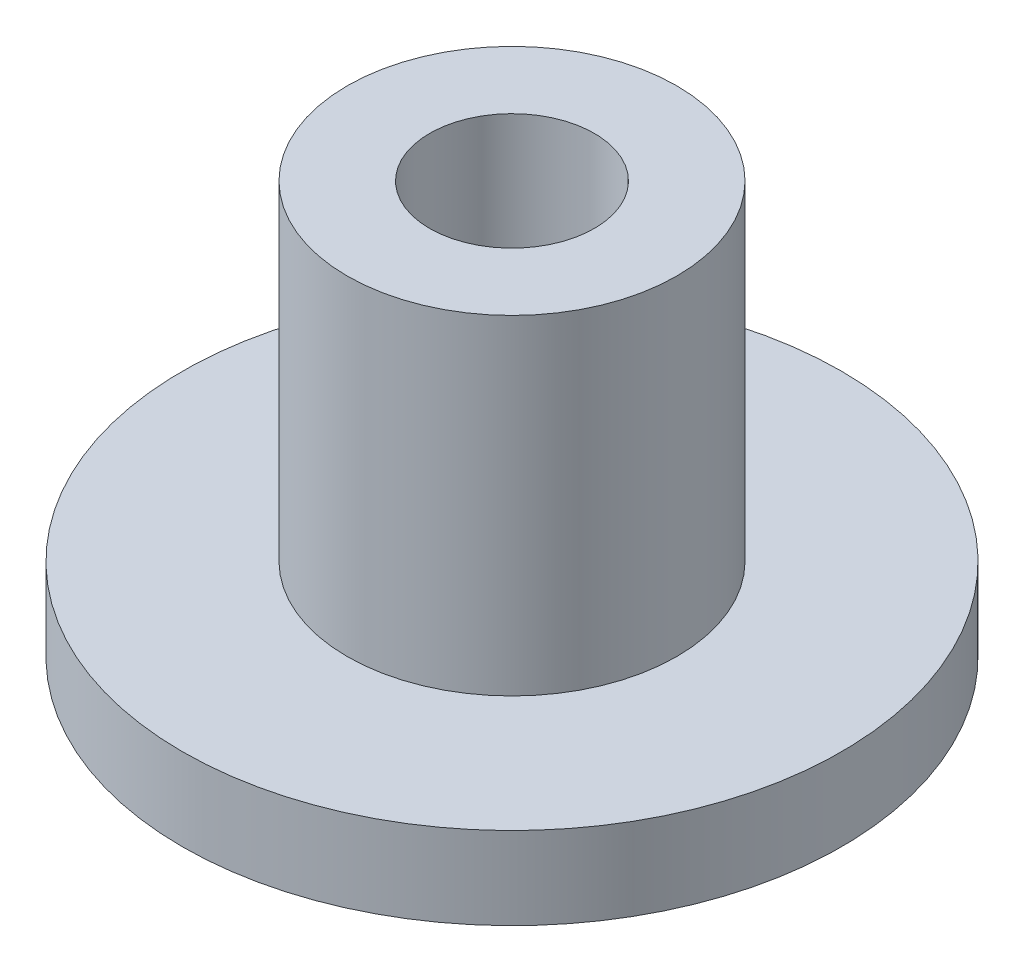
ISO-10303-21;
HEADER;
FILE_DESCRIPTION(('STEP AP214'),'2;1');
FILE_NAME('part.step','',(''),(''),'','','');
FILE_SCHEMA(('AUTOMOTIVE_DESIGN { 1 0 10303 214 1 1 1 1 }'));
ENDSEC;
DATA;
#1=APPLICATION_CONTEXT('core data for automotive mechanical design processes');
#2=APPLICATION_PROTOCOL_DEFINITION('international standard','automotive_design',2000,#1);
#3=PRODUCT_CONTEXT('',#1,'mechanical');
#4=PRODUCT('Part','Part','',(#3));
#5=PRODUCT_RELATED_PRODUCT_CATEGORY('part','',(#4));
#6=PRODUCT_DEFINITION_FORMATION('','',#4);
#7=PRODUCT_DEFINITION_CONTEXT('part definition',#1,'design');
#8=PRODUCT_DEFINITION('design','',#6,#7);
#9=PRODUCT_DEFINITION_SHAPE('','',#8);
#10=(LENGTH_UNIT() NAMED_UNIT(*) SI_UNIT(.MILLI.,.METRE.));
#11=(NAMED_UNIT(*) PLANE_ANGLE_UNIT() SI_UNIT($,.RADIAN.));
#12=(NAMED_UNIT(*) SI_UNIT($,.STERADIAN.) SOLID_ANGLE_UNIT());
#13=UNCERTAINTY_MEASURE_WITH_UNIT(LENGTH_MEASURE(1.E-05),#10,'distance_accuracy_value','');
#14=(GEOMETRIC_REPRESENTATION_CONTEXT(3) GLOBAL_UNCERTAINTY_ASSIGNED_CONTEXT((#13)) GLOBAL_UNIT_ASSIGNED_CONTEXT((#10,
#11,#12)) REPRESENTATION_CONTEXT('',''));
#15=CARTESIAN_POINT('',(0.,0.,0.));
#16=DIRECTION('',(0.,0.,1.));
#17=DIRECTION('',(1.,0.,0.));
#18=AXIS2_PLACEMENT_3D('',#15,#16,#17);
#19=CARTESIAN_POINT('',(0.,1.,0.));
#20=DIRECTION('',(0.,-1.,0.));
#21=DIRECTION('',(0.,0.,-1.));
#22=AXIS2_PLACEMENT_3D('',#19,#20,#21);
#23=CYLINDRICAL_SURFACE('',#22,4.);
#24=CARTESIAN_POINT('',(0.,1.,0.));
#25=DIRECTION('',(0.,1.,0.));
#26=DIRECTION('',(0.,0.,1.));
#27=AXIS2_PLACEMENT_3D('',#24,#25,#26);
#28=CIRCLE('',#27,4.);
#29=CARTESIAN_POINT('',(0.,1.,4.));
#30=VERTEX_POINT('',#29);
#31=EDGE_CURVE('E38',#30,#30,#28,.T.);
#32=ORIENTED_EDGE('',*,*,#31,.F.);
#33=EDGE_LOOP('',(#32));
#34=FACE_BOUND('',#33,.T.);
#35=CARTESIAN_POINT('',(0.,0.,0.));
#36=DIRECTION('',(0.,1.,0.));
#37=DIRECTION('',(0.,0.,1.));
#38=AXIS2_PLACEMENT_3D('',#35,#36,#37);
#39=CIRCLE('',#38,4.);
#40=CARTESIAN_POINT('',(0.,0.,4.));
#41=VERTEX_POINT('',#40);
#42=EDGE_CURVE('E34',#41,#41,#39,.T.);
#43=ORIENTED_EDGE('',*,*,#42,.T.);
#44=EDGE_LOOP('',(#43));
#45=FACE_BOUND('',#44,.T.);
#46=ADVANCED_FACE('F31',(#34,#45),#23,.T.);
#47=CARTESIAN_POINT('',(0.,1.,0.));
#48=DIRECTION('',(0.,1.,0.));
#49=DIRECTION('',(0.,0.,1.));
#50=AXIS2_PLACEMENT_3D('',#47,#48,#49);
#51=PLANE('',#50);
#52=CARTESIAN_POINT('',(0.,1.,0.));
#53=DIRECTION('',(0.,1.,0.));
#54=DIRECTION('',(0.,0.,1.));
#55=AXIS2_PLACEMENT_3D('',#52,#53,#54);
#56=CIRCLE('',#55,2.);
#57=CARTESIAN_POINT('',(0.,1.,2.));
#58=VERTEX_POINT('',#57);
#59=EDGE_CURVE('E10',#58,#58,#56,.T.);
#60=ORIENTED_EDGE('',*,*,#59,.F.);
#61=EDGE_LOOP('',(#60));
#62=FACE_BOUND('',#61,.T.);
#63=ORIENTED_EDGE('',*,*,#31,.T.);
#64=EDGE_LOOP('',(#63));
#65=FACE_BOUND('',#64,.T.);
#66=ADVANCED_FACE('F75',(#62,#65),#51,.T.);
#67=CARTESIAN_POINT('',(0.,0.,0.));
#68=DIRECTION('',(0.,1.,0.));
#69=DIRECTION('',(0.,0.,1.));
#70=AXIS2_PLACEMENT_3D('',#67,#68,#69);
#71=PLANE('',#70);
#72=CARTESIAN_POINT('',(0.,0.,0.));
#73=DIRECTION('',(0.,1.,0.));
#74=DIRECTION('',(0.,0.,1.));
#75=AXIS2_PLACEMENT_3D('',#72,#73,#74);
#76=CIRCLE('',#75,1.);
#77=CARTESIAN_POINT('',(0.,0.,1.));
#78=VERTEX_POINT('',#77);
#79=EDGE_CURVE('E47',#78,#78,#76,.T.);
#80=ORIENTED_EDGE('',*,*,#79,.T.);
#81=EDGE_LOOP('',(#80));
#82=FACE_BOUND('',#81,.T.);
#83=ORIENTED_EDGE('',*,*,#42,.F.);
#84=EDGE_LOOP('',(#83));
#85=FACE_BOUND('',#84,.T.);
#86=ADVANCED_FACE('F54',(#82,#85),#71,.F.);
#87=CARTESIAN_POINT('',(0.,5.,0.));
#88=DIRECTION('',(0.,-1.,0.));
#89=DIRECTION('',(0.,0.,-1.));
#90=AXIS2_PLACEMENT_3D('',#87,#88,#89);
#91=CYLINDRICAL_SURFACE('',#90,2.);
#92=CARTESIAN_POINT('',(0.,5.,0.));
#93=DIRECTION('',(0.,1.,0.));
#94=DIRECTION('',(0.,0.,1.));
#95=AXIS2_PLACEMENT_3D('',#92,#93,#94);
#96=CIRCLE('',#95,2.);
#97=CARTESIAN_POINT('',(0.,5.,2.));
#98=VERTEX_POINT('',#97);
#99=EDGE_CURVE('E44',#98,#98,#96,.T.);
#100=ORIENTED_EDGE('',*,*,#99,.F.);
#101=EDGE_LOOP('',(#100));
#102=FACE_BOUND('',#101,.T.);
#103=ORIENTED_EDGE('',*,*,#59,.T.);
#104=EDGE_LOOP('',(#103));
#105=FACE_BOUND('',#104,.T.);
#106=ADVANCED_FACE('F66',(#102,#105),#91,.T.);
#107=CARTESIAN_POINT('',(0.,5.,0.));
#108=DIRECTION('',(0.,1.,0.));
#109=DIRECTION('',(0.,0.,1.));
#110=AXIS2_PLACEMENT_3D('',#107,#108,#109);
#111=PLANE('',#110);
#112=CARTESIAN_POINT('',(0.,5.,0.));
#113=DIRECTION('',(0.,1.,0.));
#114=DIRECTION('',(0.,0.,1.));
#115=AXIS2_PLACEMENT_3D('',#112,#113,#114);
#116=CIRCLE('',#115,1.);
#117=CARTESIAN_POINT('',(0.,5.,1.));
#118=VERTEX_POINT('',#117);
#119=EDGE_CURVE('E48',#118,#118,#116,.T.);
#120=ORIENTED_EDGE('',*,*,#119,.F.);
#121=EDGE_LOOP('',(#120));
#122=FACE_BOUND('',#121,.T.);
#123=ORIENTED_EDGE('',*,*,#99,.T.);
#124=EDGE_LOOP('',(#123));
#125=FACE_BOUND('',#124,.T.);
#126=ADVANCED_FACE('F60',(#122,#125),#111,.T.);
#127=CARTESIAN_POINT('',(0.,0.,0.));
#128=DIRECTION('',(0.,1.,0.));
#129=DIRECTION('',(0.,0.,1.));
#130=AXIS2_PLACEMENT_3D('',#127,#128,#129);
#131=CYLINDRICAL_SURFACE('',#130,1.);
#132=ORIENTED_EDGE('',*,*,#79,.F.);
#133=EDGE_LOOP('',(#132));
#134=FACE_BOUND('',#133,.T.);
#135=ORIENTED_EDGE('',*,*,#119,.T.);
#136=EDGE_LOOP('',(#135));
#137=FACE_BOUND('',#136,.T.);
#138=ADVANCED_FACE('F57',(#134,#137),#131,.F.);
#139=CLOSED_SHELL('',(#46,#66,#86,#106,#126,#138));
#140=MANIFOLD_SOLID_BREP('B2',#139);
#141=ADVANCED_BREP_SHAPE_REPRESENTATION('',(#18,#140),#14);
#142=SHAPE_DEFINITION_REPRESENTATION(#9,#141);
ENDSEC;
END-ISO-10303-21;
